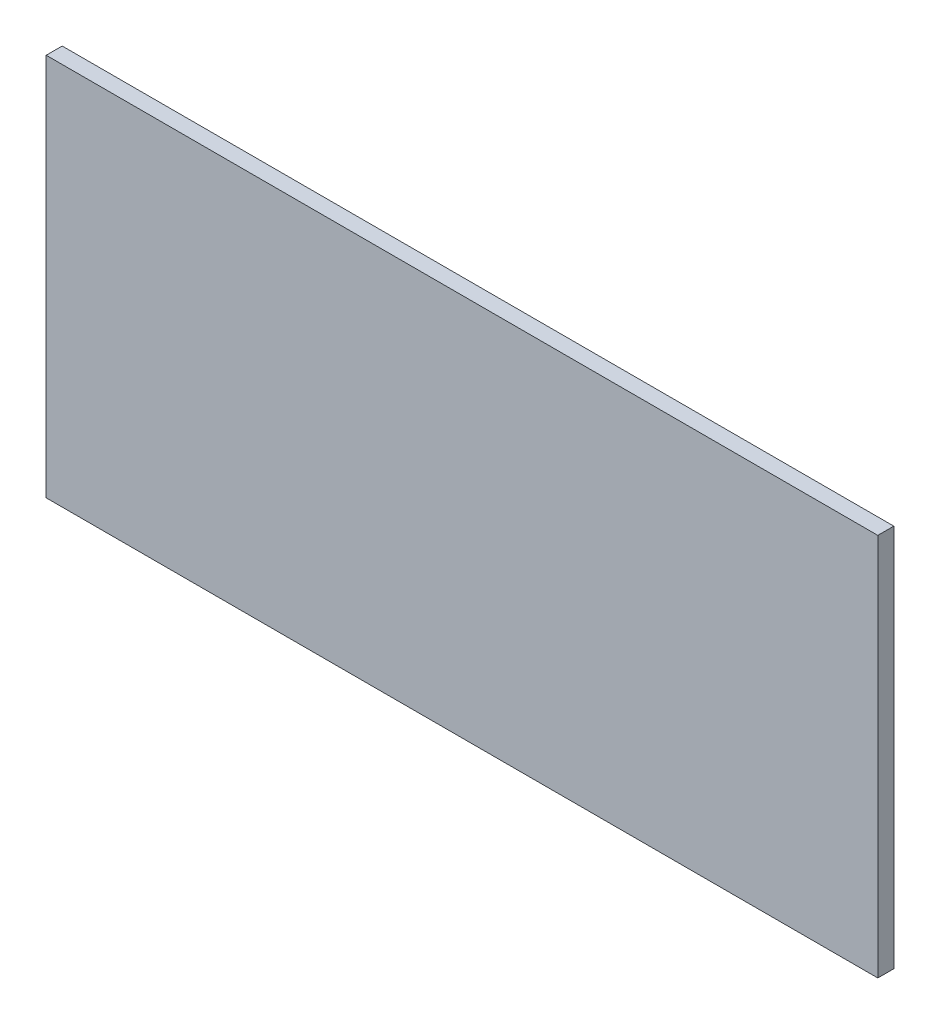
ISO-10303-21;
HEADER;
FILE_DESCRIPTION(('STEP AP214'),'2;1');
FILE_NAME('part.step','',(''),(''),'','','');
FILE_SCHEMA(('AUTOMOTIVE_DESIGN { 1 0 10303 214 1 1 1 1 }'));
ENDSEC;
DATA;
#1=APPLICATION_CONTEXT('core data for automotive mechanical design processes');
#2=APPLICATION_PROTOCOL_DEFINITION('international standard','automotive_design',2000,#1);
#3=PRODUCT_CONTEXT('',#1,'mechanical');
#4=PRODUCT('Part','Part','',(#3));
#5=PRODUCT_RELATED_PRODUCT_CATEGORY('part','',(#4));
#6=PRODUCT_DEFINITION_FORMATION('','',#4);
#7=PRODUCT_DEFINITION_CONTEXT('part definition',#1,'design');
#8=PRODUCT_DEFINITION('design','',#6,#7);
#9=PRODUCT_DEFINITION_SHAPE('','',#8);
#10=(LENGTH_UNIT() NAMED_UNIT(*) SI_UNIT(.MILLI.,.METRE.));
#11=(NAMED_UNIT(*) PLANE_ANGLE_UNIT() SI_UNIT($,.RADIAN.));
#12=(NAMED_UNIT(*) SI_UNIT($,.STERADIAN.) SOLID_ANGLE_UNIT());
#13=UNCERTAINTY_MEASURE_WITH_UNIT(LENGTH_MEASURE(1.E-05),#10,'distance_accuracy_value','');
#14=(GEOMETRIC_REPRESENTATION_CONTEXT(3) GLOBAL_UNCERTAINTY_ASSIGNED_CONTEXT((#13)) GLOBAL_UNIT_ASSIGNED_CONTEXT((#10,
#11,#12)) REPRESENTATION_CONTEXT('',''));
#15=CARTESIAN_POINT('',(0.,0.,0.));
#16=DIRECTION('',(0.,0.,1.));
#17=DIRECTION('',(1.,0.,0.));
#18=AXIS2_PLACEMENT_3D('',#15,#16,#17);
#19=CARTESIAN_POINT('',(154.6125,44.322,2.286));
#20=DIRECTION('',(-1.,0.,0.));
#21=DIRECTION('',(0.,0.,1.));
#22=AXIS2_PLACEMENT_3D('',#19,#20,#21);
#23=PLANE('',#22);
#24=DIRECTION('',(0.,0.,1.));
#25=VECTOR('',#24,1.);
#26=CARTESIAN_POINT('',(154.6125,10.4737156294298,0.));
#27=LINE('',#26,#25);
#28=CARTESIAN_POINT('',(154.6125,10.4737156294298,0.));
#29=VERTEX_POINT('',#28);
#30=CARTESIAN_POINT('',(154.6125,10.4737156294298,2.286));
#31=VERTEX_POINT('',#30);
#32=EDGE_CURVE('E96',#29,#31,#27,.T.);
#33=ORIENTED_EDGE('',*,*,#32,.T.);
#34=DIRECTION('',(0.,1.,0.));
#35=VECTOR('',#34,1.);
#36=CARTESIAN_POINT('',(154.6125,44.322,2.286));
#37=LINE('',#36,#35);
#38=CARTESIAN_POINT('',(154.6125,-44.322,2.286));
#39=VERTEX_POINT('',#38);
#40=EDGE_CURVE('E94',#39,#31,#37,.T.);
#41=ORIENTED_EDGE('',*,*,#40,.F.);
#42=DIRECTION('',(0.,0.,-1.));
#43=VECTOR('',#42,1.);
#44=CARTESIAN_POINT('',(154.6125,-44.322,2.286));
#45=LINE('',#44,#43);
#46=CARTESIAN_POINT('',(154.6125,-44.322,0.));
#47=VERTEX_POINT('',#46);
#48=EDGE_CURVE('E11',#39,#47,#45,.T.);
#49=ORIENTED_EDGE('',*,*,#48,.T.);
#50=DIRECTION('',(0.,1.,0.));
#51=VECTOR('',#50,1.);
#52=CARTESIAN_POINT('',(154.6125,44.322,0.));
#53=LINE('',#52,#51);
#54=EDGE_CURVE('E93',#47,#29,#53,.T.);
#55=ORIENTED_EDGE('',*,*,#54,.T.);
#56=EDGE_LOOP('',(#33,#41,#49,#55));
#57=FACE_BOUND('',#56,.T.);
#58=ADVANCED_FACE('F37',(#57),#23,.F.);
#59=CARTESIAN_POINT('',(-154.6125,-44.322,2.286));
#60=DIRECTION('',(0.,1.,0.));
#61=DIRECTION('',(0.,0.,1.));
#62=AXIS2_PLACEMENT_3D('',#59,#60,#61);
#63=PLANE('',#62);
#64=DIRECTION('',(0.,0.,1.));
#65=VECTOR('',#64,1.);
#66=CARTESIAN_POINT('',(35.7399447894715,-44.322,0.));
#67=LINE('',#66,#65);
#68=CARTESIAN_POINT('',(35.7399447894715,-44.322,0.));
#69=VERTEX_POINT('',#68);
#70=CARTESIAN_POINT('',(35.7399447894715,-44.322,2.286));
#71=VERTEX_POINT('',#70);
#72=EDGE_CURVE('E79',#69,#71,#67,.T.);
#73=ORIENTED_EDGE('',*,*,#72,.F.);
#74=DIRECTION('',(1.,0.,0.));
#75=VECTOR('',#74,1.);
#76=CARTESIAN_POINT('',(-154.6125,-44.322,0.));
#77=LINE('',#76,#75);
#78=EDGE_CURVE('E88',#69,#47,#77,.T.);
#79=ORIENTED_EDGE('',*,*,#78,.T.);
#80=ORIENTED_EDGE('',*,*,#48,.F.);
#81=DIRECTION('',(1.,0.,0.));
#82=VECTOR('',#81,1.);
#83=CARTESIAN_POINT('',(-154.6125,-44.322,2.286));
#84=LINE('',#83,#82);
#85=EDGE_CURVE('E44',#71,#39,#84,.T.);
#86=ORIENTED_EDGE('',*,*,#85,.F.);
#87=EDGE_LOOP('',(#73,#79,#80,#86));
#88=FACE_BOUND('',#87,.T.);
#89=ADVANCED_FACE('F87',(#88),#63,.F.);
#90=CARTESIAN_POINT('',(0.,0.,2.286));
#91=DIRECTION('',(0.,0.,1.));
#92=DIRECTION('',(1.,0.,0.));
#93=AXIS2_PLACEMENT_3D('',#90,#91,#92);
#94=PLANE('',#93);
#95=ORIENTED_EDGE('',*,*,#40,.T.);
#96=DIRECTION('',(-1.,0.,0.));
#97=VECTOR('',#96,1.);
#98=CARTESIAN_POINT('',(0.,10.4737156294298,2.286));
#99=LINE('',#98,#97);
#100=CARTESIAN_POINT('',(35.7399447894715,10.4737156294298,2.286));
#101=VERTEX_POINT('',#100);
#102=EDGE_CURVE('E84',#31,#101,#99,.T.);
#103=ORIENTED_EDGE('',*,*,#102,.T.);
#104=DIRECTION('',(0.,-1.,0.));
#105=VECTOR('',#104,1.);
#106=CARTESIAN_POINT('',(35.7399447894715,0.,2.286));
#107=LINE('',#106,#105);
#108=EDGE_CURVE('E105',#101,#71,#107,.T.);
#109=ORIENTED_EDGE('',*,*,#108,.T.);
#110=ORIENTED_EDGE('',*,*,#85,.T.);
#111=EDGE_LOOP('',(#95,#103,#109,#110));
#112=FACE_BOUND('',#111,.T.);
#113=ADVANCED_FACE('F111',(#112),#94,.T.);
#114=CARTESIAN_POINT('',(0.,0.,0.));
#115=DIRECTION('',(0.,0.,1.));
#116=DIRECTION('',(1.,0.,0.));
#117=AXIS2_PLACEMENT_3D('',#114,#115,#116);
#118=PLANE('',#117);
#119=DIRECTION('',(-1.,0.,0.));
#120=VECTOR('',#119,1.);
#121=CARTESIAN_POINT('',(0.,10.4737156294298,0.));
#122=LINE('',#121,#120);
#123=CARTESIAN_POINT('',(35.7399447894715,10.4737156294298,0.));
#124=VERTEX_POINT('',#123);
#125=EDGE_CURVE('E83',#29,#124,#122,.T.);
#126=ORIENTED_EDGE('',*,*,#125,.F.);
#127=ORIENTED_EDGE('',*,*,#54,.F.);
#128=ORIENTED_EDGE('',*,*,#78,.F.);
#129=DIRECTION('',(0.,-1.,0.));
#130=VECTOR('',#129,1.);
#131=CARTESIAN_POINT('',(35.7399447894715,0.,0.));
#132=LINE('',#131,#130);
#133=EDGE_CURVE('E76',#124,#69,#132,.T.);
#134=ORIENTED_EDGE('',*,*,#133,.F.);
#135=EDGE_LOOP('',(#126,#127,#128,#134));
#136=FACE_BOUND('',#135,.T.);
#137=ADVANCED_FACE('F91',(#136),#118,.F.);
#138=CARTESIAN_POINT('',(0.,10.4737156294298,0.));
#139=DIRECTION('',(0.,1.,0.));
#140=DIRECTION('',(0.,0.,1.));
#141=AXIS2_PLACEMENT_3D('',#138,#139,#140);
#142=PLANE('',#141);
#143=ORIENTED_EDGE('',*,*,#102,.F.);
#144=ORIENTED_EDGE('',*,*,#32,.F.);
#145=ORIENTED_EDGE('',*,*,#125,.T.);
#146=DIRECTION('',(0.,0.,1.));
#147=VECTOR('',#146,1.);
#148=CARTESIAN_POINT('',(35.7399447894715,10.4737156294298,0.));
#149=LINE('',#148,#147);
#150=EDGE_CURVE('E51',#124,#101,#149,.T.);
#151=ORIENTED_EDGE('',*,*,#150,.T.);
#152=EDGE_LOOP('',(#143,#144,#145,#151));
#153=FACE_BOUND('',#152,.T.);
#154=ADVANCED_FACE('F108',(#153),#142,.T.);
#155=CARTESIAN_POINT('',(35.7399447894715,0.,0.));
#156=DIRECTION('',(-1.,0.,0.));
#157=DIRECTION('',(0.,-1.,0.));
#158=AXIS2_PLACEMENT_3D('',#155,#156,#157);
#159=PLANE('',#158);
#160=ORIENTED_EDGE('',*,*,#108,.F.);
#161=ORIENTED_EDGE('',*,*,#150,.F.);
#162=ORIENTED_EDGE('',*,*,#133,.T.);
#163=ORIENTED_EDGE('',*,*,#72,.T.);
#164=EDGE_LOOP('',(#160,#161,#162,#163));
#165=FACE_BOUND('',#164,.T.);
#166=ADVANCED_FACE('F78',(#165),#159,.T.);
#167=CLOSED_SHELL('',(#58,#89,#113,#137,#154,#166));
#168=MANIFOLD_SOLID_BREP('B2',#167);
#169=ADVANCED_BREP_SHAPE_REPRESENTATION('',(#18,#168),#14);
#170=SHAPE_DEFINITION_REPRESENTATION(#9,#169);
ENDSEC;
END-ISO-10303-21;
